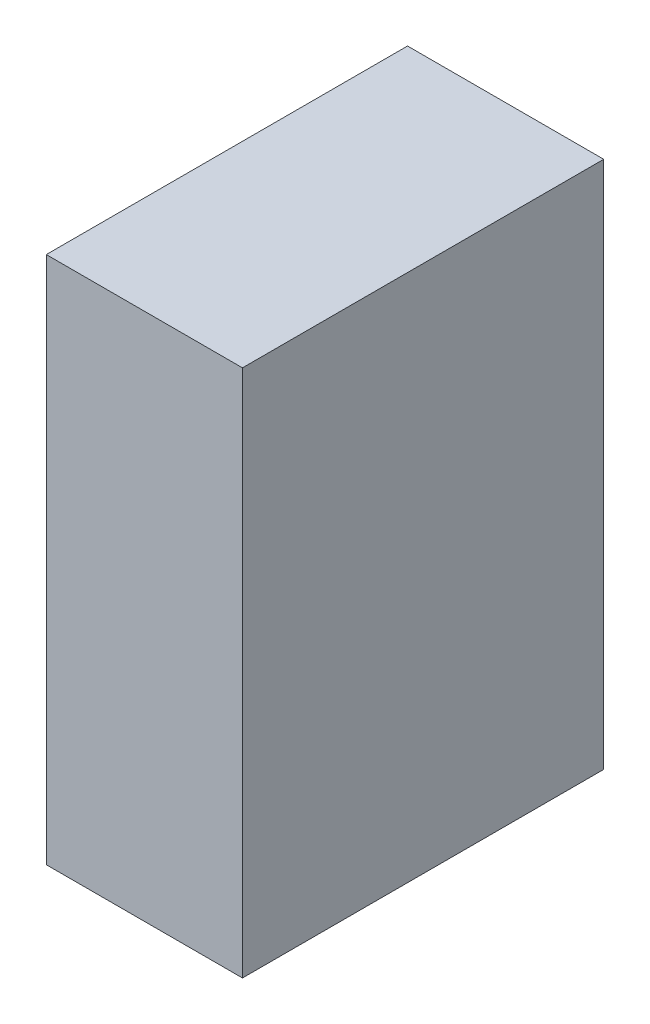
ISO-10303-21;
HEADER;
FILE_DESCRIPTION(('STEP AP214'),'2;1');
FILE_NAME('part.step','',(''),(''),'','','');
FILE_SCHEMA(('AUTOMOTIVE_DESIGN { 1 0 10303 214 1 1 1 1 }'));
ENDSEC;
DATA;
#1=APPLICATION_CONTEXT('core data for automotive mechanical design processes');
#2=APPLICATION_PROTOCOL_DEFINITION('international standard','automotive_design',2000,#1);
#3=PRODUCT_CONTEXT('',#1,'mechanical');
#4=PRODUCT('Part','Part','',(#3));
#5=PRODUCT_RELATED_PRODUCT_CATEGORY('part','',(#4));
#6=PRODUCT_DEFINITION_FORMATION('','',#4);
#7=PRODUCT_DEFINITION_CONTEXT('part definition',#1,'design');
#8=PRODUCT_DEFINITION('design','',#6,#7);
#9=PRODUCT_DEFINITION_SHAPE('','',#8);
#10=(LENGTH_UNIT() NAMED_UNIT(*) SI_UNIT(.MILLI.,.METRE.));
#11=(NAMED_UNIT(*) PLANE_ANGLE_UNIT() SI_UNIT($,.RADIAN.));
#12=(NAMED_UNIT(*) SI_UNIT($,.STERADIAN.) SOLID_ANGLE_UNIT());
#13=UNCERTAINTY_MEASURE_WITH_UNIT(LENGTH_MEASURE(1.E-05),#10,'distance_accuracy_value','');
#14=(GEOMETRIC_REPRESENTATION_CONTEXT(3) GLOBAL_UNCERTAINTY_ASSIGNED_CONTEXT((#13)) GLOBAL_UNIT_ASSIGNED_CONTEXT((#10,
#11,#12)) REPRESENTATION_CONTEXT('',''));
#15=CARTESIAN_POINT('',(0.,0.,0.));
#16=DIRECTION('',(0.,0.,1.));
#17=DIRECTION('',(1.,0.,0.));
#18=AXIS2_PLACEMENT_3D('',#15,#16,#17);
#19=CARTESIAN_POINT('',(-36.2434022642371,55.,1.66368578625683));
#20=DIRECTION('',(1.,0.,0.));
#21=DIRECTION('',(0.,0.,-1.));
#22=AXIS2_PLACEMENT_3D('',#19,#20,#21);
#23=PLANE('',#22);
#24=DIRECTION('',(0.,0.,1.));
#25=VECTOR('',#24,1.);
#26=CARTESIAN_POINT('',(-36.2434022642371,0.,1.66368578625683));
#27=LINE('',#26,#25);
#28=CARTESIAN_POINT('',(-36.2434022642371,0.,1.66368578625683));
#29=VERTEX_POINT('',#28);
#30=CARTESIAN_POINT('',(-36.2434022642371,0.,39.2636857862568));
#31=VERTEX_POINT('',#30);
#32=EDGE_CURVE('E100',#29,#31,#27,.T.);
#33=ORIENTED_EDGE('',*,*,#32,.T.);
#34=DIRECTION('',(0.,-1.,0.));
#35=VECTOR('',#34,1.);
#36=CARTESIAN_POINT('',(-36.2434022642371,55.,39.2636857862568));
#37=LINE('',#36,#35);
#38=CARTESIAN_POINT('',(-36.2434022642371,55.,39.2636857862568));
#39=VERTEX_POINT('',#38);
#40=EDGE_CURVE('E11',#39,#31,#37,.T.);
#41=ORIENTED_EDGE('',*,*,#40,.F.);
#42=DIRECTION('',(0.,0.,1.));
#43=VECTOR('',#42,1.);
#44=CARTESIAN_POINT('',(-36.2434022642371,55.,1.66368578625683));
#45=LINE('',#44,#43);
#46=CARTESIAN_POINT('',(-36.2434022642371,55.,1.66368578625683));
#47=VERTEX_POINT('',#46);
#48=EDGE_CURVE('E88',#47,#39,#45,.T.);
#49=ORIENTED_EDGE('',*,*,#48,.F.);
#50=DIRECTION('',(0.,-1.,0.));
#51=VECTOR('',#50,1.);
#52=CARTESIAN_POINT('',(-36.2434022642371,55.,1.66368578625683));
#53=LINE('',#52,#51);
#54=EDGE_CURVE('E96',#47,#29,#53,.T.);
#55=ORIENTED_EDGE('',*,*,#54,.T.);
#56=EDGE_LOOP('',(#33,#41,#49,#55));
#57=FACE_BOUND('',#56,.T.);
#58=ADVANCED_FACE('F37',(#57),#23,.F.);
#59=CARTESIAN_POINT('',(-36.2434022642371,55.,39.2636857862568));
#60=DIRECTION('',(0.,0.,-1.));
#61=DIRECTION('',(-1.,0.,0.));
#62=AXIS2_PLACEMENT_3D('',#59,#60,#61);
#63=PLANE('',#62);
#64=DIRECTION('',(1.,0.,0.));
#65=VECTOR('',#64,1.);
#66=CARTESIAN_POINT('',(-36.2434022642371,0.,39.2636857862568));
#67=LINE('',#66,#65);
#68=CARTESIAN_POINT('',(-15.8234022642371,0.,39.2636857862568));
#69=VERTEX_POINT('',#68);
#70=EDGE_CURVE('E92',#31,#69,#67,.T.);
#71=ORIENTED_EDGE('',*,*,#70,.T.);
#72=DIRECTION('',(0.,-1.,0.));
#73=VECTOR('',#72,1.);
#74=CARTESIAN_POINT('',(-15.8234022642371,55.,39.2636857862568));
#75=LINE('',#74,#73);
#76=CARTESIAN_POINT('',(-15.8234022642371,55.,39.2636857862568));
#77=VERTEX_POINT('',#76);
#78=EDGE_CURVE('E45',#77,#69,#75,.T.);
#79=ORIENTED_EDGE('',*,*,#78,.F.);
#80=DIRECTION('',(1.,0.,0.));
#81=VECTOR('',#80,1.);
#82=CARTESIAN_POINT('',(-36.2434022642371,55.,39.2636857862568));
#83=LINE('',#82,#81);
#84=EDGE_CURVE('E83',#39,#77,#83,.T.);
#85=ORIENTED_EDGE('',*,*,#84,.F.);
#86=ORIENTED_EDGE('',*,*,#40,.T.);
#87=EDGE_LOOP('',(#71,#79,#85,#86));
#88=FACE_BOUND('',#87,.T.);
#89=ADVANCED_FACE('F91',(#88),#63,.F.);
#90=CARTESIAN_POINT('',(-15.8234022642371,55.,1.66368578625683));
#91=DIRECTION('',(-1.,0.,0.));
#92=DIRECTION('',(0.,0.,1.));
#93=AXIS2_PLACEMENT_3D('',#90,#91,#92);
#94=PLANE('',#93);
#95=DIRECTION('',(0.,0.,-1.));
#96=VECTOR('',#95,1.);
#97=CARTESIAN_POINT('',(-15.8234022642371,0.,1.66368578625683));
#98=LINE('',#97,#96);
#99=CARTESIAN_POINT('',(-15.8234022642371,0.,1.66368578625683));
#100=VERTEX_POINT('',#99);
#101=EDGE_CURVE('E70',#69,#100,#98,.T.);
#102=ORIENTED_EDGE('',*,*,#101,.T.);
#103=DIRECTION('',(0.,-1.,0.));
#104=VECTOR('',#103,1.);
#105=CARTESIAN_POINT('',(-15.8234022642371,55.,1.66368578625683));
#106=LINE('',#105,#104);
#107=CARTESIAN_POINT('',(-15.8234022642371,55.,1.66368578625683));
#108=VERTEX_POINT('',#107);
#109=EDGE_CURVE('E93',#108,#100,#106,.T.);
#110=ORIENTED_EDGE('',*,*,#109,.F.);
#111=DIRECTION('',(0.,0.,-1.));
#112=VECTOR('',#111,1.);
#113=CARTESIAN_POINT('',(-15.8234022642371,55.,1.66368578625683));
#114=LINE('',#113,#112);
#115=EDGE_CURVE('E86',#77,#108,#114,.T.);
#116=ORIENTED_EDGE('',*,*,#115,.F.);
#117=ORIENTED_EDGE('',*,*,#78,.T.);
#118=EDGE_LOOP('',(#102,#110,#116,#117));
#119=FACE_BOUND('',#118,.T.);
#120=ADVANCED_FACE('F94',(#119),#94,.F.);
#121=CARTESIAN_POINT('',(-36.2434022642371,55.,1.66368578625683));
#122=DIRECTION('',(0.,0.,1.));
#123=DIRECTION('',(1.,0.,0.));
#124=AXIS2_PLACEMENT_3D('',#121,#122,#123);
#125=PLANE('',#124);
#126=DIRECTION('',(-1.,0.,0.));
#127=VECTOR('',#126,1.);
#128=CARTESIAN_POINT('',(-36.2434022642371,0.,1.66368578625683));
#129=LINE('',#128,#127);
#130=EDGE_CURVE('E76',#100,#29,#129,.T.);
#131=ORIENTED_EDGE('',*,*,#130,.T.);
#132=ORIENTED_EDGE('',*,*,#54,.F.);
#133=DIRECTION('',(-1.,0.,0.));
#134=VECTOR('',#133,1.);
#135=CARTESIAN_POINT('',(-36.2434022642371,55.,1.66368578625683));
#136=LINE('',#135,#134);
#137=EDGE_CURVE('E53',#108,#47,#136,.T.);
#138=ORIENTED_EDGE('',*,*,#137,.F.);
#139=ORIENTED_EDGE('',*,*,#109,.T.);
#140=EDGE_LOOP('',(#131,#132,#138,#139));
#141=FACE_BOUND('',#140,.T.);
#142=ADVANCED_FACE('F107',(#141),#125,.F.);
#143=CARTESIAN_POINT('',(0.,55.,0.));
#144=DIRECTION('',(0.,1.,0.));
#145=DIRECTION('',(0.,0.,1.));
#146=AXIS2_PLACEMENT_3D('',#143,#144,#145);
#147=PLANE('',#146);
#148=ORIENTED_EDGE('',*,*,#48,.T.);
#149=ORIENTED_EDGE('',*,*,#84,.T.);
#150=ORIENTED_EDGE('',*,*,#115,.T.);
#151=ORIENTED_EDGE('',*,*,#137,.T.);
#152=EDGE_LOOP('',(#148,#149,#150,#151));
#153=FACE_BOUND('',#152,.T.);
#154=ADVANCED_FACE('F84',(#153),#147,.T.);
#155=CARTESIAN_POINT('',(0.,0.,0.));
#156=DIRECTION('',(0.,1.,0.));
#157=DIRECTION('',(0.,0.,1.));
#158=AXIS2_PLACEMENT_3D('',#155,#156,#157);
#159=PLANE('',#158);
#160=ORIENTED_EDGE('',*,*,#32,.F.);
#161=ORIENTED_EDGE('',*,*,#130,.F.);
#162=ORIENTED_EDGE('',*,*,#101,.F.);
#163=ORIENTED_EDGE('',*,*,#70,.F.);
#164=EDGE_LOOP('',(#160,#161,#162,#163));
#165=FACE_BOUND('',#164,.T.);
#166=ADVANCED_FACE('F110',(#165),#159,.F.);
#167=CLOSED_SHELL('',(#58,#89,#120,#142,#154,#166));
#168=MANIFOLD_SOLID_BREP('B2',#167);
#169=ADVANCED_BREP_SHAPE_REPRESENTATION('',(#18,#168),#14);
#170=SHAPE_DEFINITION_REPRESENTATION(#9,#169);
ENDSEC;
END-ISO-10303-21;
